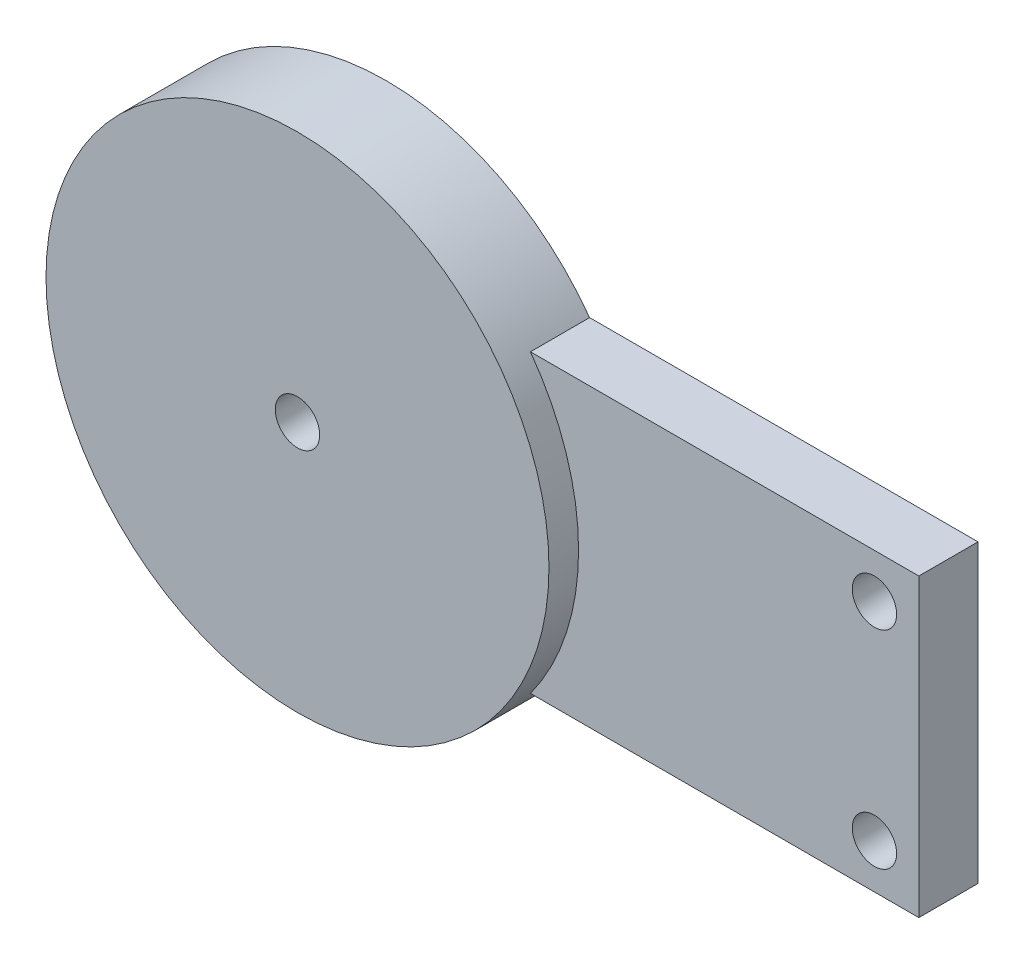
ISO-10303-21;
HEADER;
FILE_DESCRIPTION(('STEP AP214'),'2;1');
FILE_NAME('part.step','',(''),(''),'','','');
FILE_SCHEMA(('AUTOMOTIVE_DESIGN { 1 0 10303 214 1 1 1 1 }'));
ENDSEC;
DATA;
#1=APPLICATION_CONTEXT('core data for automotive mechanical design processes');
#2=APPLICATION_PROTOCOL_DEFINITION('international standard','automotive_design',2000,#1);
#3=PRODUCT_CONTEXT('',#1,'mechanical');
#4=PRODUCT('Part','Part','',(#3));
#5=PRODUCT_RELATED_PRODUCT_CATEGORY('part','',(#4));
#6=PRODUCT_DEFINITION_FORMATION('','',#4);
#7=PRODUCT_DEFINITION_CONTEXT('part definition',#1,'design');
#8=PRODUCT_DEFINITION('design','',#6,#7);
#9=PRODUCT_DEFINITION_SHAPE('','',#8);
#10=(LENGTH_UNIT() NAMED_UNIT(*) SI_UNIT(.MILLI.,.METRE.));
#11=(NAMED_UNIT(*) PLANE_ANGLE_UNIT() SI_UNIT($,.RADIAN.));
#12=(NAMED_UNIT(*) SI_UNIT($,.STERADIAN.) SOLID_ANGLE_UNIT());
#13=UNCERTAINTY_MEASURE_WITH_UNIT(LENGTH_MEASURE(1.E-05),#10,'distance_accuracy_value','');
#14=(GEOMETRIC_REPRESENTATION_CONTEXT(3) GLOBAL_UNCERTAINTY_ASSIGNED_CONTEXT((#13)) GLOBAL_UNIT_ASSIGNED_CONTEXT((#10,
#11,#12)) REPRESENTATION_CONTEXT('',''));
#15=CARTESIAN_POINT('',(0.,0.,0.));
#16=DIRECTION('',(0.,0.,1.));
#17=DIRECTION('',(1.,0.,0.));
#18=AXIS2_PLACEMENT_3D('',#15,#16,#17);
#19=CARTESIAN_POINT('',(-0.933123743386466,-6.90255919765331,1.));
#20=DIRECTION('',(-0.133966605224204,-0.990985846863971,0.));
#21=DIRECTION('',(0.990985846863971,-0.133966605224204,0.));
#22=AXIS2_PLACEMENT_3D('',#19,#20,#21);
#23=PLANE('',#22);
#24=DIRECTION('',(-0.990985846863971,0.133966605224204,0.));
#25=VECTOR('',#24,1.);
#26=CARTESIAN_POINT('',(-0.933123743386466,-6.90255919765331,1.));
#27=LINE('',#26,#25);
#28=CARTESIAN_POINT('',(-27.3521116164976,-3.33110342962163,1.));
#29=VERTEX_POINT('',#28);
#30=CARTESIAN_POINT('',(-33.5,-2.5,1.));
#31=VERTEX_POINT('',#30);
#32=EDGE_CURVE('E341',#29,#31,#27,.T.);
#33=ORIENTED_EDGE('',*,*,#32,.F.);
#34=DIRECTION('',(0.,0.,1.));
#35=VECTOR('',#34,1.);
#36=CARTESIAN_POINT('',(-27.3521116164976,-3.33110342962163,-2.));
#37=LINE('',#36,#35);
#38=CARTESIAN_POINT('',(-27.3521116164976,-3.33110342962163,-2.));
#39=VERTEX_POINT('',#38);
#40=EDGE_CURVE('E396',#29,#39,#37,.F.);
#41=ORIENTED_EDGE('',*,*,#40,.T.);
#42=DIRECTION('',(-0.990985846863971,0.133966605224204,0.));
#43=VECTOR('',#42,1.);
#44=CARTESIAN_POINT('',(-0.933123743386466,-6.90255919765331,-2.));
#45=LINE('',#44,#43);
#46=CARTESIAN_POINT('',(-33.5,-2.5,-2.));
#47=VERTEX_POINT('',#46);
#48=EDGE_CURVE('E349',#39,#47,#45,.T.);
#49=ORIENTED_EDGE('',*,*,#48,.T.);
#50=DIRECTION('',(0.,0.,-1.));
#51=VECTOR('',#50,1.);
#52=CARTESIAN_POINT('',(-33.5,-2.5,1.));
#53=LINE('',#52,#51);
#54=EDGE_CURVE('E347',#31,#47,#53,.T.);
#55=ORIENTED_EDGE('',*,*,#54,.F.);
#56=EDGE_LOOP('',(#33,#41,#49,#55));
#57=FACE_BOUND('',#56,.T.);
#58=ADVANCED_FACE('F41',(#57),#23,.F.);
#59=CARTESIAN_POINT('',(0.,0.,-2.));
#60=DIRECTION('',(0.,0.,-1.));
#61=DIRECTION('',(-1.,0.,0.));
#62=AXIS2_PLACEMENT_3D('',#59,#60,#61);
#63=PLANE('',#62);
#64=CARTESIAN_POINT('',(17.,7.,-2.));
#65=DIRECTION('',(0.,0.,-1.));
#66=DIRECTION('',(-1.,0.,0.));
#67=AXIS2_PLACEMENT_3D('',#64,#65,#66);
#68=CIRCLE('',#67,1.5);
#69=CARTESIAN_POINT('',(15.5,7.,-2.));
#70=VERTEX_POINT('',#69);
#71=EDGE_CURVE('E526',#70,#70,#68,.F.);
#72=ORIENTED_EDGE('',*,*,#71,.T.);
#73=EDGE_LOOP('',(#72));
#74=FACE_BOUND('',#73,.T.);
#75=CARTESIAN_POINT('',(17.,-7.,-2.));
#76=DIRECTION('',(0.,0.,-1.));
#77=DIRECTION('',(-1.,0.,0.));
#78=AXIS2_PLACEMENT_3D('',#75,#76,#77);
#79=CIRCLE('',#78,1.5);
#80=CARTESIAN_POINT('',(15.5,-7.,-2.));
#81=VERTEX_POINT('',#80);
#82=EDGE_CURVE('E523',#81,#81,#79,.F.);
#83=ORIENTED_EDGE('',*,*,#82,.T.);
#84=EDGE_LOOP('',(#83));
#85=FACE_BOUND('',#84,.T.);
#86=ORIENTED_EDGE('',*,*,#48,.F.);
#87=CARTESIAN_POINT('',(-27.4860782217218,-4.3220892764856,-2.));
#88=DIRECTION('',(0.,0.,-1.));
#89=DIRECTION('',(-1.,0.,0.));
#90=AXIS2_PLACEMENT_3D('',#87,#88,#89);
#91=CIRCLE('',#90,1.);
#92=CARTESIAN_POINT('',(-26.5608760009346,-4.70156371653467,-2.));
#93=VERTEX_POINT('',#92);
#94=EDGE_CURVE('E408',#39,#93,#91,.T.);
#95=ORIENTED_EDGE('',*,*,#94,.T.);
#96=DIRECTION('',(-0.379474440049075,-0.925202220787132,0.));
#97=VECTOR('',#96,1.);
#98=CARTESIAN_POINT('',(-16.4443534879867,19.9636788078683,-2.));
#99=LINE('',#98,#97);
#100=CARTESIAN_POINT('',(-28.9150635094612,-10.4413429510898,-2.));
#101=VERTEX_POINT('',#100);
#102=EDGE_CURVE('E251',#93,#101,#99,.T.);
#103=ORIENTED_EDGE('',*,*,#102,.T.);
#104=CARTESIAN_POINT('',(-26.7500000000001,-11.6913429510898,-2.));
#105=DIRECTION('',(0.,0.,-1.));
#106=DIRECTION('',(-0.50000000000001,-0.866025403784433,0.));
#107=AXIS2_PLACEMENT_3D('',#104,#105,#106);
#108=CIRCLE('',#107,2.5);
#109=CARTESIAN_POINT('',(-24.5849364905391,-12.9413429510899,-2.));
#110=VERTEX_POINT('',#109);
#111=EDGE_CURVE('E255',#110,#101,#108,.T.);
#112=ORIENTED_EDGE('',*,*,#111,.F.);
#113=DIRECTION('',(-0.611511406814916,-0.791235615562926,0.));
#114=VECTOR('',#113,1.);
#115=CARTESIAN_POINT('',(-4.48877025539938,13.0611196102148,-2.));
#116=LINE('',#115,#114);
#117=CARTESIAN_POINT('',(-20.791235615563,-8.03266714615627,-2.));
#118=VERTEX_POINT('',#117);
#119=EDGE_CURVE('E239',#118,#110,#116,.T.);
#120=ORIENTED_EDGE('',*,*,#119,.F.);
#121=CARTESIAN_POINT('',(-20.0000000000001,-8.64417855297119,-2.));
#122=DIRECTION('',(0.,0.,-1.));
#123=DIRECTION('',(-1.,0.,0.));
#124=AXIS2_PLACEMENT_3D('',#121,#122,#123);
#125=CIRCLE('',#124,1.);
#126=CARTESIAN_POINT('',(-19.2087643844372,-8.0326671461563,-2.));
#127=VERTEX_POINT('',#126);
#128=EDGE_CURVE('E398',#118,#127,#125,.T.);
#129=ORIENTED_EDGE('',*,*,#128,.T.);
#130=DIRECTION('',(0.6115114068149,-0.791235615562938,0.));
#131=VECTOR('',#130,1.);
#132=CARTESIAN_POINT('',(-35.5112297446003,13.0611196102152,-2.));
#133=LINE('',#132,#131);
#134=CARTESIAN_POINT('',(-15.4150635094612,-12.94134295109,-2.));
#135=VERTEX_POINT('',#134);
#136=EDGE_CURVE('E257',#127,#135,#133,.T.);
#137=ORIENTED_EDGE('',*,*,#136,.T.);
#138=CARTESIAN_POINT('',(-13.2500000000001,-11.69134295109,-2.));
#139=DIRECTION('',(0.,0.,-1.));
#140=DIRECTION('',(0.499999999999992,-0.866025403784443,0.));
#141=AXIS2_PLACEMENT_3D('',#138,#139,#140);
#142=CIRCLE('',#141,2.5);
#143=CARTESIAN_POINT('',(-11.084936490539,-10.44134295109,-2.));
#144=VERTEX_POINT('',#143);
#145=EDGE_CURVE('E262',#144,#135,#142,.T.);
#146=ORIENTED_EDGE('',*,*,#145,.F.);
#147=DIRECTION('',(0.379474440049056,-0.92520222078714,0.));
#148=VECTOR('',#147,1.);
#149=CARTESIAN_POINT('',(-23.5556465120129,19.9636788078684,-2.));
#150=LINE('',#149,#148);
#151=CARTESIAN_POINT('',(-13.4391239990655,-4.70156371653467,-2.));
#152=VERTEX_POINT('',#151);
#153=EDGE_CURVE('E269',#152,#144,#150,.T.);
#154=ORIENTED_EDGE('',*,*,#153,.F.);
#155=CARTESIAN_POINT('',(-12.5139217782784,-4.32208927648562,-2.));
#156=DIRECTION('',(0.,0.,-1.));
#157=DIRECTION('',(-1.,0.,0.));
#158=AXIS2_PLACEMENT_3D('',#155,#156,#157);
#159=CIRCLE('',#158,1.);
#160=CARTESIAN_POINT('',(-12.6478883835026,-3.33110342962165,-2.));
#161=VERTEX_POINT('',#160);
#162=EDGE_CURVE('E406',#152,#161,#159,.T.);
#163=ORIENTED_EDGE('',*,*,#162,.T.);
#164=DIRECTION('',(0.990985846863971,0.133966605224204,0.));
#165=VECTOR('',#164,1.);
#166=CARTESIAN_POINT('',(-39.0668762566135,-6.90255919765331,-2.));
#167=LINE('',#166,#165);
#168=CARTESIAN_POINT('',(-6.5,-2.5,-2.));
#169=VERTEX_POINT('',#168);
#170=EDGE_CURVE('E276',#161,#169,#167,.T.);
#171=ORIENTED_EDGE('',*,*,#170,.T.);
#172=CARTESIAN_POINT('',(-6.50000000000001,0.,-2.));
#173=DIRECTION('',(0.,0.,-1.));
#174=DIRECTION('',(1.,0.,0.));
#175=AXIS2_PLACEMENT_3D('',#172,#173,#174);
#176=CIRCLE('',#175,2.5);
#177=CARTESIAN_POINT('',(-6.5,2.5,-2.));
#178=VERTEX_POINT('',#177);
#179=EDGE_CURVE('E282',#178,#169,#176,.T.);
#180=ORIENTED_EDGE('',*,*,#179,.F.);
#181=DIRECTION('',(0.990985846863971,-0.133966605224204,0.));
#182=VECTOR('',#181,1.);
#183=CARTESIAN_POINT('',(-39.0668762566135,6.90255919765331,-2.));
#184=LINE('',#183,#182);
#185=CARTESIAN_POINT('',(-12.6478883835025,3.33110342962163,-2.));
#186=VERTEX_POINT('',#185);
#187=EDGE_CURVE('E289',#186,#178,#184,.T.);
#188=ORIENTED_EDGE('',*,*,#187,.F.);
#189=CARTESIAN_POINT('',(-12.5139217782783,4.3220892764856,-2.));
#190=DIRECTION('',(0.,0.,-1.));
#191=DIRECTION('',(-1.,0.,0.));
#192=AXIS2_PLACEMENT_3D('',#189,#190,#191);
#193=CIRCLE('',#192,1.);
#194=CARTESIAN_POINT('',(-13.4391239990654,4.70156371653467,-2.));
#195=VERTEX_POINT('',#194);
#196=EDGE_CURVE('E400',#186,#195,#193,.T.);
#197=ORIENTED_EDGE('',*,*,#196,.T.);
#198=DIRECTION('',(0.379474440049069,0.925202220787135,0.));
#199=VECTOR('',#198,1.);
#200=CARTESIAN_POINT('',(-23.5556465120132,-19.9636788078683,-2.));
#201=LINE('',#200,#199);
#202=CARTESIAN_POINT('',(-11.0849364905389,10.4413429510899,-2.));
#203=VERTEX_POINT('',#202);
#204=EDGE_CURVE('E296',#195,#203,#201,.T.);
#205=ORIENTED_EDGE('',*,*,#204,.T.);
#206=CARTESIAN_POINT('',(-13.2499999999999,11.6913429510899,-2.));
#207=DIRECTION('',(0.,0.,-1.));
#208=DIRECTION('',(0.500000000000004,0.866025403784436,0.));
#209=AXIS2_PLACEMENT_3D('',#206,#207,#208);
#210=CIRCLE('',#209,2.5);
#211=CARTESIAN_POINT('',(-15.415063509461,12.9413429510899,-2.));
#212=VERTEX_POINT('',#211);
#213=EDGE_CURVE('E302',#212,#203,#210,.T.);
#214=ORIENTED_EDGE('',*,*,#213,.F.);
#215=DIRECTION('',(0.611511406814911,0.79123561556293,0.));
#216=VECTOR('',#215,1.);
#217=CARTESIAN_POINT('',(-35.5112297446005,-13.0611196102149,-2.));
#218=LINE('',#217,#216);
#219=CARTESIAN_POINT('',(-19.208764384437,8.0326671461563,-2.));
#220=VERTEX_POINT('',#219);
#221=EDGE_CURVE('E309',#220,#212,#218,.T.);
#222=ORIENTED_EDGE('',*,*,#221,.F.);
#223=CARTESIAN_POINT('',(-20.,8.64417855297121,-2.));
#224=DIRECTION('',(0.,0.,-1.));
#225=DIRECTION('',(-1.,0.,0.));
#226=AXIS2_PLACEMENT_3D('',#223,#224,#225);
#227=CIRCLE('',#226,1.);
#228=CARTESIAN_POINT('',(-20.7912356155629,8.0326671461563,-2.));
#229=VERTEX_POINT('',#228);
#230=EDGE_CURVE('E402',#220,#229,#227,.T.);
#231=ORIENTED_EDGE('',*,*,#230,.T.);
#232=DIRECTION('',(-0.611511406814905,0.791235615562934,0.));
#233=VECTOR('',#232,1.);
#234=CARTESIAN_POINT('',(-4.48877025539957,-13.061119610215,-2.));
#235=LINE('',#234,#233);
#236=CARTESIAN_POINT('',(-24.5849364905389,12.9413429510899,-2.));
#237=VERTEX_POINT('',#236);
#238=EDGE_CURVE('E316',#229,#237,#235,.T.);
#239=ORIENTED_EDGE('',*,*,#238,.T.);
#240=CARTESIAN_POINT('',(-26.75,11.6913429510899,-2.));
#241=DIRECTION('',(0.,0.,-1.));
#242=DIRECTION('',(-0.499999999999998,0.86602540378444,0.));
#243=AXIS2_PLACEMENT_3D('',#240,#241,#242);
#244=CIRCLE('',#243,2.5);
#245=CARTESIAN_POINT('',(-28.9150635094611,10.4413429510899,-2.));
#246=VERTEX_POINT('',#245);
#247=EDGE_CURVE('E322',#246,#237,#244,.T.);
#248=ORIENTED_EDGE('',*,*,#247,.F.);
#249=DIRECTION('',(-0.379474440049062,0.925202220787137,0.));
#250=VECTOR('',#249,1.);
#251=CARTESIAN_POINT('',(-16.444353487987,-19.9636788078683,-2.));
#252=LINE('',#251,#250);
#253=CARTESIAN_POINT('',(-26.5608760009345,4.70156371653467,-2.));
#254=VERTEX_POINT('',#253);
#255=EDGE_CURVE('E329',#254,#246,#252,.T.);
#256=ORIENTED_EDGE('',*,*,#255,.F.);
#257=CARTESIAN_POINT('',(-27.4860782217217,4.3220892764856,-2.));
#258=DIRECTION('',(0.,0.,-1.));
#259=DIRECTION('',(-1.,0.,0.));
#260=AXIS2_PLACEMENT_3D('',#257,#258,#259);
#261=CIRCLE('',#260,1.);
#262=CARTESIAN_POINT('',(-27.3521116164975,3.33110342962164,-2.));
#263=VERTEX_POINT('',#262);
#264=EDGE_CURVE('E404',#254,#263,#261,.T.);
#265=ORIENTED_EDGE('',*,*,#264,.T.);
#266=DIRECTION('',(-0.990985846863971,-0.133966605224204,0.));
#267=VECTOR('',#266,1.);
#268=CARTESIAN_POINT('',(-0.933123743386466,6.90255919765331,-2.));
#269=LINE('',#268,#267);
#270=CARTESIAN_POINT('',(-33.5,2.5,-2.));
#271=VERTEX_POINT('',#270);
#272=EDGE_CURVE('E336',#263,#271,#269,.T.);
#273=ORIENTED_EDGE('',*,*,#272,.T.);
#274=CARTESIAN_POINT('',(-33.5,0.,-2.));
#275=DIRECTION('',(0.,0.,-1.));
#276=DIRECTION('',(-1.,0.,0.));
#277=AXIS2_PLACEMENT_3D('',#274,#275,#276);
#278=CIRCLE('',#277,2.5);
#279=EDGE_CURVE('E342',#47,#271,#278,.T.);
#280=ORIENTED_EDGE('',*,*,#279,.F.);
#281=EDGE_LOOP('',(#86,#95,#103,#112,#120,#129,#137,#146,#154,#163,#171,#180,#188,#197,#205,
#214,#222,#231,#239,#248,#256,#265,#273,#280));
#282=FACE_BOUND('',#281,.T.);
#283=DIRECTION('',(1.,0.,0.));
#284=VECTOR('',#283,1.);
#285=CARTESIAN_POINT('',(-20.,-10.,-2.));
#286=LINE('',#285,#284);
#287=CARTESIAN_POINT('',(-6.25227291513248,-10.,-2.));
#288=VERTEX_POINT('',#287);
#289=CARTESIAN_POINT('',(20.,-10.,-2.));
#290=VERTEX_POINT('',#289);
#291=EDGE_CURVE('E378',#288,#290,#286,.T.);
#292=ORIENTED_EDGE('',*,*,#291,.F.);
#293=CARTESIAN_POINT('',(-20.,0.,-2.));
#294=DIRECTION('',(0.,0.,-1.));
#295=DIRECTION('',(-1.,0.,0.));
#296=AXIS2_PLACEMENT_3D('',#293,#294,#295);
#297=CIRCLE('',#296,17.);
#298=CARTESIAN_POINT('',(-6.25227291513248,10.,-2.));
#299=VERTEX_POINT('',#298);
#300=EDGE_CURVE('E356',#299,#288,#297,.F.);
#301=ORIENTED_EDGE('',*,*,#300,.F.);
#302=DIRECTION('',(-1.,0.,0.));
#303=VECTOR('',#302,1.);
#304=CARTESIAN_POINT('',(-20.,10.,-2.));
#305=LINE('',#304,#303);
#306=CARTESIAN_POINT('',(20.,10.,-2.));
#307=VERTEX_POINT('',#306);
#308=EDGE_CURVE('E385',#307,#299,#305,.T.);
#309=ORIENTED_EDGE('',*,*,#308,.F.);
#310=DIRECTION('',(0.,1.,0.));
#311=VECTOR('',#310,1.);
#312=CARTESIAN_POINT('',(20.,-10.,-2.));
#313=LINE('',#312,#311);
#314=EDGE_CURVE('E373',#290,#307,#313,.T.);
#315=ORIENTED_EDGE('',*,*,#314,.F.);
#316=EDGE_LOOP('',(#292,#301,#309,#315));
#317=FACE_BOUND('',#316,.T.);
#318=ADVANCED_FACE('F455',(#74,#85,#282,#317),#63,.T.);
#319=CARTESIAN_POINT('',(-20.,10.,2.));
#320=DIRECTION('',(0.,-1.,0.));
#321=DIRECTION('',(0.,0.,-1.));
#322=AXIS2_PLACEMENT_3D('',#319,#320,#321);
#323=PLANE('',#322);
#324=DIRECTION('',(0.,0.,-1.));
#325=VECTOR('',#324,1.);
#326=CARTESIAN_POINT('',(-6.25227291513248,10.,4.));
#327=LINE('',#326,#325);
#328=CARTESIAN_POINT('',(-6.25227291513248,10.,2.));
#329=VERTEX_POINT('',#328);
#330=EDGE_CURVE('E370',#329,#299,#327,.T.);
#331=ORIENTED_EDGE('',*,*,#330,.F.);
#332=DIRECTION('',(-1.,0.,0.));
#333=VECTOR('',#332,1.);
#334=CARTESIAN_POINT('',(-20.,10.,2.));
#335=LINE('',#334,#333);
#336=CARTESIAN_POINT('',(20.,10.,2.));
#337=VERTEX_POINT('',#336);
#338=EDGE_CURVE('E377',#337,#329,#335,.T.);
#339=ORIENTED_EDGE('',*,*,#338,.F.);
#340=DIRECTION('',(0.,0.,-1.));
#341=VECTOR('',#340,1.);
#342=CARTESIAN_POINT('',(20.,10.,2.));
#343=LINE('',#342,#341);
#344=EDGE_CURVE('E390',#337,#307,#343,.T.);
#345=ORIENTED_EDGE('',*,*,#344,.T.);
#346=ORIENTED_EDGE('',*,*,#308,.T.);
#347=EDGE_LOOP('',(#331,#339,#345,#346));
#348=FACE_BOUND('',#347,.T.);
#349=ADVANCED_FACE('F555',(#348),#323,.F.);
#350=CARTESIAN_POINT('',(-20.,-10.,2.));
#351=DIRECTION('',(0.,1.,0.));
#352=DIRECTION('',(0.,0.,1.));
#353=AXIS2_PLACEMENT_3D('',#350,#351,#352);
#354=PLANE('',#353);
#355=DIRECTION('',(0.,0.,-1.));
#356=VECTOR('',#355,1.);
#357=CARTESIAN_POINT('',(-6.25227291513248,-10.,4.));
#358=LINE('',#357,#356);
#359=CARTESIAN_POINT('',(-6.25227291513248,-10.,2.));
#360=VERTEX_POINT('',#359);
#361=EDGE_CURVE('E367',#288,#360,#358,.F.);
#362=ORIENTED_EDGE('',*,*,#361,.F.);
#363=ORIENTED_EDGE('',*,*,#291,.T.);
#364=DIRECTION('',(0.,0.,-1.));
#365=VECTOR('',#364,1.);
#366=CARTESIAN_POINT('',(20.,-10.,2.));
#367=LINE('',#366,#365);
#368=CARTESIAN_POINT('',(20.,-10.,2.));
#369=VERTEX_POINT('',#368);
#370=EDGE_CURVE('E382',#369,#290,#367,.T.);
#371=ORIENTED_EDGE('',*,*,#370,.F.);
#372=DIRECTION('',(1.,0.,0.));
#373=VECTOR('',#372,1.);
#374=CARTESIAN_POINT('',(-20.,-10.,2.));
#375=LINE('',#374,#373);
#376=EDGE_CURVE('E380',#360,#369,#375,.T.);
#377=ORIENTED_EDGE('',*,*,#376,.F.);
#378=EDGE_LOOP('',(#362,#363,#371,#377));
#379=FACE_BOUND('',#378,.T.);
#380=ADVANCED_FACE('F547',(#379),#354,.F.);
#381=CARTESIAN_POINT('',(20.,-10.,2.));
#382=DIRECTION('',(-1.,0.,0.));
#383=DIRECTION('',(0.,0.,1.));
#384=AXIS2_PLACEMENT_3D('',#381,#382,#383);
#385=PLANE('',#384);
#386=ORIENTED_EDGE('',*,*,#314,.T.);
#387=ORIENTED_EDGE('',*,*,#344,.F.);
#388=DIRECTION('',(0.,1.,0.));
#389=VECTOR('',#388,1.);
#390=CARTESIAN_POINT('',(20.,-10.,2.));
#391=LINE('',#390,#389);
#392=EDGE_CURVE('E374',#369,#337,#391,.T.);
#393=ORIENTED_EDGE('',*,*,#392,.F.);
#394=ORIENTED_EDGE('',*,*,#370,.T.);
#395=EDGE_LOOP('',(#386,#387,#393,#394));
#396=FACE_BOUND('',#395,.T.);
#397=ADVANCED_FACE('F538',(#396),#385,.F.);
#398=CARTESIAN_POINT('',(0.,0.,2.));
#399=DIRECTION('',(0.,0.,-1.));
#400=DIRECTION('',(-1.,0.,0.));
#401=AXIS2_PLACEMENT_3D('',#398,#399,#400);
#402=PLANE('',#401);
#403=CARTESIAN_POINT('',(17.,7.,2.));
#404=DIRECTION('',(0.,0.,1.));
#405=DIRECTION('',(1.,0.,0.));
#406=AXIS2_PLACEMENT_3D('',#403,#404,#405);
#407=CIRCLE('',#406,1.5);
#408=CARTESIAN_POINT('',(18.5,7.,2.));
#409=VERTEX_POINT('',#408);
#410=EDGE_CURVE('E517',#409,#409,#407,.T.);
#411=ORIENTED_EDGE('',*,*,#410,.F.);
#412=EDGE_LOOP('',(#411));
#413=FACE_BOUND('',#412,.T.);
#414=CARTESIAN_POINT('',(17.,-7.,2.));
#415=DIRECTION('',(0.,0.,1.));
#416=DIRECTION('',(1.,0.,0.));
#417=AXIS2_PLACEMENT_3D('',#414,#415,#416);
#418=CIRCLE('',#417,1.5);
#419=CARTESIAN_POINT('',(18.5,-7.,2.));
#420=VERTEX_POINT('',#419);
#421=EDGE_CURVE('E520',#420,#420,#418,.T.);
#422=ORIENTED_EDGE('',*,*,#421,.F.);
#423=EDGE_LOOP('',(#422));
#424=FACE_BOUND('',#423,.T.);
#425=CARTESIAN_POINT('',(-20.,0.,2.));
#426=DIRECTION('',(0.,0.,-1.));
#427=DIRECTION('',(-1.,0.,0.));
#428=AXIS2_PLACEMENT_3D('',#425,#426,#427);
#429=CIRCLE('',#428,17.);
#430=EDGE_CURVE('E364',#360,#329,#429,.F.);
#431=ORIENTED_EDGE('',*,*,#430,.F.);
#432=ORIENTED_EDGE('',*,*,#376,.T.);
#433=ORIENTED_EDGE('',*,*,#392,.T.);
#434=ORIENTED_EDGE('',*,*,#338,.T.);
#435=EDGE_LOOP('',(#431,#432,#433,#434));
#436=FACE_BOUND('',#435,.T.);
#437=ADVANCED_FACE('F534',(#413,#424,#436),#402,.F.);
#438=CARTESIAN_POINT('',(-20.,0.,4.));
#439=DIRECTION('',(0.,0.,-1.));
#440=DIRECTION('',(-1.,0.,0.));
#441=AXIS2_PLACEMENT_3D('',#438,#439,#440);
#442=CYLINDRICAL_SURFACE('',#441,17.);
#443=CARTESIAN_POINT('',(-20.,0.,4.));
#444=DIRECTION('',(0.,0.,1.));
#445=DIRECTION('',(1.,0.,0.));
#446=AXIS2_PLACEMENT_3D('',#443,#444,#445);
#447=CIRCLE('',#446,17.);
#448=CARTESIAN_POINT('',(-3.,0.,4.));
#449=VERTEX_POINT('',#448);
#450=EDGE_CURVE('E361',#449,#449,#447,.T.);
#451=ORIENTED_EDGE('',*,*,#450,.F.);
#452=EDGE_LOOP('',(#451));
#453=FACE_BOUND('',#452,.T.);
#454=ORIENTED_EDGE('',*,*,#430,.T.);
#455=ORIENTED_EDGE('',*,*,#330,.T.);
#456=ORIENTED_EDGE('',*,*,#300,.T.);
#457=ORIENTED_EDGE('',*,*,#361,.T.);
#458=EDGE_LOOP('',(#454,#455,#456,#457));
#459=FACE_BOUND('',#458,.T.);
#460=ADVANCED_FACE('F537',(#453,#459),#442,.T.);
#461=CARTESIAN_POINT('',(-20.,0.,4.));
#462=DIRECTION('',(0.,0.,1.));
#463=DIRECTION('',(1.,0.,0.));
#464=AXIS2_PLACEMENT_3D('',#461,#462,#463);
#465=PLANE('',#464);
#466=CARTESIAN_POINT('',(-20.,0.,4.));
#467=DIRECTION('',(0.,0.,1.));
#468=DIRECTION('',(1.,0.,0.));
#469=AXIS2_PLACEMENT_3D('',#466,#467,#468);
#470=CIRCLE('',#469,1.5);
#471=CARTESIAN_POINT('',(-18.5,0.,4.));
#472=VERTEX_POINT('',#471);
#473=EDGE_CURVE('E253',#472,#472,#470,.T.);
#474=ORIENTED_EDGE('',*,*,#473,.F.);
#475=EDGE_LOOP('',(#474));
#476=FACE_BOUND('',#475,.T.);
#477=ORIENTED_EDGE('',*,*,#450,.T.);
#478=EDGE_LOOP('',(#477));
#479=FACE_BOUND('',#478,.T.);
#480=ADVANCED_FACE('F575',(#476,#479),#465,.T.);
#481=CARTESIAN_POINT('',(-0.933123743386466,6.90255919765331,1.));
#482=DIRECTION('',(0.133966605224204,-0.990985846863971,0.));
#483=DIRECTION('',(0.990985846863971,0.133966605224204,0.));
#484=AXIS2_PLACEMENT_3D('',#481,#482,#483);
#485=PLANE('',#484);
#486=ORIENTED_EDGE('',*,*,#272,.F.);
#487=DIRECTION('',(0.,0.,-1.));
#488=VECTOR('',#487,1.);
#489=CARTESIAN_POINT('',(-27.3521116164975,3.33110342962164,1.));
#490=LINE('',#489,#488);
#491=CARTESIAN_POINT('',(-27.3521116164975,3.33110342962164,1.));
#492=VERTEX_POINT('',#491);
#493=EDGE_CURVE('E418',#263,#492,#490,.F.);
#494=ORIENTED_EDGE('',*,*,#493,.T.);
#495=DIRECTION('',(-0.990985846863971,-0.133966605224204,0.));
#496=VECTOR('',#495,1.);
#497=CARTESIAN_POINT('',(-0.933123743386466,6.90255919765331,1.));
#498=LINE('',#497,#496);
#499=CARTESIAN_POINT('',(-33.5,2.5,1.));
#500=VERTEX_POINT('',#499);
#501=EDGE_CURVE('E339',#492,#500,#498,.T.);
#502=ORIENTED_EDGE('',*,*,#501,.T.);
#503=DIRECTION('',(0.,0.,-1.));
#504=VECTOR('',#503,1.);
#505=CARTESIAN_POINT('',(-33.5,2.5,1.));
#506=LINE('',#505,#504);
#507=EDGE_CURVE('E353',#500,#271,#506,.T.);
#508=ORIENTED_EDGE('',*,*,#507,.T.);
#509=EDGE_LOOP('',(#486,#494,#502,#508));
#510=FACE_BOUND('',#509,.T.);
#511=ADVANCED_FACE('F496',(#510),#485,.T.);
#512=CARTESIAN_POINT('',(-33.5,0.,1.));
#513=DIRECTION('',(0.,0.,-1.));
#514=DIRECTION('',(-1.,0.,0.));
#515=AXIS2_PLACEMENT_3D('',#512,#513,#514);
#516=CYLINDRICAL_SURFACE('',#515,2.5);
#517=ORIENTED_EDGE('',*,*,#279,.T.);
#518=ORIENTED_EDGE('',*,*,#507,.F.);
#519=CARTESIAN_POINT('',(-33.5,0.,1.));
#520=DIRECTION('',(0.,0.,-1.));
#521=DIRECTION('',(-1.,0.,0.));
#522=AXIS2_PLACEMENT_3D('',#519,#520,#521);
#523=CIRCLE('',#522,2.5);
#524=EDGE_CURVE('E344',#31,#500,#523,.T.);
#525=ORIENTED_EDGE('',*,*,#524,.F.);
#526=ORIENTED_EDGE('',*,*,#54,.T.);
#527=EDGE_LOOP('',(#517,#518,#525,#526));
#528=FACE_BOUND('',#527,.T.);
#529=ADVANCED_FACE('F502',(#528),#516,.F.);
#530=CARTESIAN_POINT('',(0.,0.,1.));
#531=DIRECTION('',(0.,0.,-1.));
#532=DIRECTION('',(-1.,0.,0.));
#533=AXIS2_PLACEMENT_3D('',#530,#531,#532);
#534=PLANE('',#533);
#535=CARTESIAN_POINT('',(-20.,0.,1.));
#536=DIRECTION('',(0.,0.,-1.));
#537=DIRECTION('',(-1.,0.,0.));
#538=AXIS2_PLACEMENT_3D('',#535,#536,#537);
#539=CIRCLE('',#538,1.5);
#540=CARTESIAN_POINT('',(-21.5,0.,1.));
#541=VERTEX_POINT('',#540);
#542=EDGE_CURVE('E514',#541,#541,#539,.F.);
#543=ORIENTED_EDGE('',*,*,#542,.T.);
#544=EDGE_LOOP('',(#543));
#545=FACE_BOUND('',#544,.T.);
#546=ORIENTED_EDGE('',*,*,#501,.F.);
#547=CARTESIAN_POINT('',(-27.4860782217217,4.3220892764856,1.));
#548=DIRECTION('',(0.,0.,-1.));
#549=DIRECTION('',(-1.,0.,0.));
#550=AXIS2_PLACEMENT_3D('',#547,#548,#549);
#551=CIRCLE('',#550,1.);
#552=CARTESIAN_POINT('',(-26.5608760009345,4.70156371653467,1.));
#553=VERTEX_POINT('',#552);
#554=EDGE_CURVE('E437',#492,#553,#551,.F.);
#555=ORIENTED_EDGE('',*,*,#554,.T.);
#556=DIRECTION('',(-0.379474440049062,0.925202220787137,0.));
#557=VECTOR('',#556,1.);
#558=CARTESIAN_POINT('',(-16.444353487987,-19.9636788078683,1.));
#559=LINE('',#558,#557);
#560=CARTESIAN_POINT('',(-28.9150635094611,10.4413429510899,1.));
#561=VERTEX_POINT('',#560);
#562=EDGE_CURVE('E321',#553,#561,#559,.T.);
#563=ORIENTED_EDGE('',*,*,#562,.T.);
#564=CARTESIAN_POINT('',(-26.75,11.6913429510899,1.));
#565=DIRECTION('',(0.,0.,-1.));
#566=DIRECTION('',(-0.499999999999998,0.86602540378444,0.));
#567=AXIS2_PLACEMENT_3D('',#564,#565,#566);
#568=CIRCLE('',#567,2.5);
#569=CARTESIAN_POINT('',(-24.5849364905389,12.9413429510899,1.));
#570=VERTEX_POINT('',#569);
#571=EDGE_CURVE('E324',#561,#570,#568,.T.);
#572=ORIENTED_EDGE('',*,*,#571,.T.);
#573=DIRECTION('',(-0.611511406814905,0.791235615562934,0.));
#574=VECTOR('',#573,1.);
#575=CARTESIAN_POINT('',(-4.48877025539957,-13.061119610215,1.));
#576=LINE('',#575,#574);
#577=CARTESIAN_POINT('',(-20.7912356155629,8.0326671461563,1.));
#578=VERTEX_POINT('',#577);
#579=EDGE_CURVE('E319',#578,#570,#576,.T.);
#580=ORIENTED_EDGE('',*,*,#579,.F.);
#581=CARTESIAN_POINT('',(-20.,8.64417855297121,1.));
#582=DIRECTION('',(0.,0.,-1.));
#583=DIRECTION('',(-1.,0.,0.));
#584=AXIS2_PLACEMENT_3D('',#581,#582,#583);
#585=CIRCLE('',#584,1.);
#586=CARTESIAN_POINT('',(-19.208764384437,8.0326671461563,1.));
#587=VERTEX_POINT('',#586);
#588=EDGE_CURVE('E439',#578,#587,#585,.F.);
#589=ORIENTED_EDGE('',*,*,#588,.T.);
#590=DIRECTION('',(0.611511406814911,0.79123561556293,0.));
#591=VECTOR('',#590,1.);
#592=CARTESIAN_POINT('',(-35.5112297446005,-13.0611196102149,1.));
#593=LINE('',#592,#591);
#594=CARTESIAN_POINT('',(-15.415063509461,12.9413429510899,1.));
#595=VERTEX_POINT('',#594);
#596=EDGE_CURVE('E301',#587,#595,#593,.T.);
#597=ORIENTED_EDGE('',*,*,#596,.T.);
#598=CARTESIAN_POINT('',(-13.2499999999999,11.6913429510899,1.));
#599=DIRECTION('',(0.,0.,-1.));
#600=DIRECTION('',(0.500000000000004,0.866025403784436,0.));
#601=AXIS2_PLACEMENT_3D('',#598,#599,#600);
#602=CIRCLE('',#601,2.5);
#603=CARTESIAN_POINT('',(-11.0849364905389,10.4413429510899,1.));
#604=VERTEX_POINT('',#603);
#605=EDGE_CURVE('E304',#595,#604,#602,.T.);
#606=ORIENTED_EDGE('',*,*,#605,.T.);
#607=DIRECTION('',(0.379474440049069,0.925202220787135,0.));
#608=VECTOR('',#607,1.);
#609=CARTESIAN_POINT('',(-23.5556465120132,-19.9636788078683,1.));
#610=LINE('',#609,#608);
#611=CARTESIAN_POINT('',(-13.4391239990654,4.70156371653467,1.));
#612=VERTEX_POINT('',#611);
#613=EDGE_CURVE('E299',#612,#604,#610,.T.);
#614=ORIENTED_EDGE('',*,*,#613,.F.);
#615=CARTESIAN_POINT('',(-12.5139217782783,4.3220892764856,1.));
#616=DIRECTION('',(0.,0.,-1.));
#617=DIRECTION('',(-1.,0.,0.));
#618=AXIS2_PLACEMENT_3D('',#615,#616,#617);
#619=CIRCLE('',#618,1.);
#620=CARTESIAN_POINT('',(-12.6478883835025,3.33110342962163,1.));
#621=VERTEX_POINT('',#620);
#622=EDGE_CURVE('E49',#612,#621,#619,.F.);
#623=ORIENTED_EDGE('',*,*,#622,.T.);
#624=DIRECTION('',(0.990985846863971,-0.133966605224204,0.));
#625=VECTOR('',#624,1.);
#626=CARTESIAN_POINT('',(-39.0668762566135,6.90255919765331,1.));
#627=LINE('',#626,#625);
#628=CARTESIAN_POINT('',(-6.5,2.5,1.));
#629=VERTEX_POINT('',#628);
#630=EDGE_CURVE('E281',#621,#629,#627,.T.);
#631=ORIENTED_EDGE('',*,*,#630,.T.);
#632=CARTESIAN_POINT('',(-6.50000000000001,0.,1.));
#633=DIRECTION('',(0.,0.,-1.));
#634=DIRECTION('',(1.,0.,0.));
#635=AXIS2_PLACEMENT_3D('',#632,#633,#634);
#636=CIRCLE('',#635,2.5);
#637=CARTESIAN_POINT('',(-6.5,-2.5,1.));
#638=VERTEX_POINT('',#637);
#639=EDGE_CURVE('E284',#629,#638,#636,.T.);
#640=ORIENTED_EDGE('',*,*,#639,.T.);
#641=DIRECTION('',(0.990985846863971,0.133966605224204,0.));
#642=VECTOR('',#641,1.);
#643=CARTESIAN_POINT('',(-39.0668762566135,-6.90255919765331,1.));
#644=LINE('',#643,#642);
#645=CARTESIAN_POINT('',(-12.6478883835026,-3.33110342962165,1.));
#646=VERTEX_POINT('',#645);
#647=EDGE_CURVE('E279',#646,#638,#644,.T.);
#648=ORIENTED_EDGE('',*,*,#647,.F.);
#649=CARTESIAN_POINT('',(-12.5139217782784,-4.32208927648562,1.));
#650=DIRECTION('',(0.,0.,-1.));
#651=DIRECTION('',(-1.,0.,0.));
#652=AXIS2_PLACEMENT_3D('',#649,#650,#651);
#653=CIRCLE('',#652,1.);
#654=CARTESIAN_POINT('',(-13.4391239990655,-4.70156371653467,1.));
#655=VERTEX_POINT('',#654);
#656=EDGE_CURVE('E435',#646,#655,#653,.F.);
#657=ORIENTED_EDGE('',*,*,#656,.T.);
#658=DIRECTION('',(0.379474440049056,-0.92520222078714,0.));
#659=VECTOR('',#658,1.);
#660=CARTESIAN_POINT('',(-23.5556465120129,19.9636788078684,1.));
#661=LINE('',#660,#659);
#662=CARTESIAN_POINT('',(-11.084936490539,-10.44134295109,1.));
#663=VERTEX_POINT('',#662);
#664=EDGE_CURVE('E261',#655,#663,#661,.T.);
#665=ORIENTED_EDGE('',*,*,#664,.T.);
#666=CARTESIAN_POINT('',(-13.2500000000001,-11.69134295109,1.));
#667=DIRECTION('',(0.,0.,-1.));
#668=DIRECTION('',(0.499999999999992,-0.866025403784443,0.));
#669=AXIS2_PLACEMENT_3D('',#666,#667,#668);
#670=CIRCLE('',#669,2.5);
#671=CARTESIAN_POINT('',(-15.4150635094612,-12.94134295109,1.));
#672=VERTEX_POINT('',#671);
#673=EDGE_CURVE('E264',#663,#672,#670,.T.);
#674=ORIENTED_EDGE('',*,*,#673,.T.);
#675=DIRECTION('',(0.6115114068149,-0.791235615562938,0.));
#676=VECTOR('',#675,1.);
#677=CARTESIAN_POINT('',(-35.5112297446003,13.0611196102152,1.));
#678=LINE('',#677,#676);
#679=CARTESIAN_POINT('',(-19.2087643844372,-8.0326671461563,1.));
#680=VERTEX_POINT('',#679);
#681=EDGE_CURVE('E259',#680,#672,#678,.T.);
#682=ORIENTED_EDGE('',*,*,#681,.F.);
#683=CARTESIAN_POINT('',(-20.0000000000001,-8.64417855297119,1.));
#684=DIRECTION('',(0.,0.,-1.));
#685=DIRECTION('',(-1.,0.,0.));
#686=AXIS2_PLACEMENT_3D('',#683,#684,#685);
#687=CIRCLE('',#686,1.);
#688=CARTESIAN_POINT('',(-20.791235615563,-8.03266714615627,1.));
#689=VERTEX_POINT('',#688);
#690=EDGE_CURVE('E11',#680,#689,#687,.F.);
#691=ORIENTED_EDGE('',*,*,#690,.T.);
#692=DIRECTION('',(-0.611511406814916,-0.791235615562926,0.));
#693=VECTOR('',#692,1.);
#694=CARTESIAN_POINT('',(-4.48877025539938,13.0611196102148,1.));
#695=LINE('',#694,#693);
#696=CARTESIAN_POINT('',(-24.5849364905391,-12.9413429510899,1.));
#697=VERTEX_POINT('',#696);
#698=EDGE_CURVE('E223',#689,#697,#695,.T.);
#699=ORIENTED_EDGE('',*,*,#698,.T.);
#700=CARTESIAN_POINT('',(-26.7500000000001,-11.6913429510898,1.));
#701=DIRECTION('',(0.,0.,-1.));
#702=DIRECTION('',(-0.50000000000001,-0.866025403784433,0.));
#703=AXIS2_PLACEMENT_3D('',#700,#701,#702);
#704=CIRCLE('',#703,2.5);
#705=CARTESIAN_POINT('',(-28.9150635094612,-10.4413429510898,1.));
#706=VERTEX_POINT('',#705);
#707=EDGE_CURVE('E229',#697,#706,#704,.T.);
#708=ORIENTED_EDGE('',*,*,#707,.T.);
#709=DIRECTION('',(-0.379474440049075,-0.925202220787132,0.));
#710=VECTOR('',#709,1.);
#711=CARTESIAN_POINT('',(-16.4443534879867,19.9636788078683,1.));
#712=LINE('',#711,#710);
#713=CARTESIAN_POINT('',(-26.5608760009346,-4.70156371653467,1.));
#714=VERTEX_POINT('',#713);
#715=EDGE_CURVE('E233',#714,#706,#712,.T.);
#716=ORIENTED_EDGE('',*,*,#715,.F.);
#717=CARTESIAN_POINT('',(-27.4860782217218,-4.3220892764856,1.));
#718=DIRECTION('',(0.,0.,-1.));
#719=DIRECTION('',(-1.,0.,0.));
#720=AXIS2_PLACEMENT_3D('',#717,#718,#719);
#721=CIRCLE('',#720,1.);
#722=EDGE_CURVE('E433',#714,#29,#721,.F.);
#723=ORIENTED_EDGE('',*,*,#722,.T.);
#724=ORIENTED_EDGE('',*,*,#32,.T.);
#725=ORIENTED_EDGE('',*,*,#524,.T.);
#726=EDGE_LOOP('',(#546,#555,#563,#572,#580,#589,#597,#606,#614,#623,#631,#640,#648,#657,#665,
#674,#682,#691,#699,#708,#716,#723,#724,#725));
#727=FACE_BOUND('',#726,.T.);
#728=ADVANCED_FACE('F226',(#545,#727),#534,.T.);
#729=CARTESIAN_POINT('',(-16.4443534879867,19.9636788078683,1.));
#730=DIRECTION('',(0.925202220787132,-0.379474440049075,0.));
#731=DIRECTION('',(0.379474440049075,0.925202220787132,0.));
#732=AXIS2_PLACEMENT_3D('',#729,#730,#731);
#733=PLANE('',#732);
#734=ORIENTED_EDGE('',*,*,#102,.F.);
#735=DIRECTION('',(0.,0.,1.));
#736=VECTOR('',#735,1.);
#737=CARTESIAN_POINT('',(-26.5608760009346,-4.70156371653467,1.));
#738=LINE('',#737,#736);
#739=EDGE_CURVE('E393',#93,#714,#738,.T.);
#740=ORIENTED_EDGE('',*,*,#739,.T.);
#741=ORIENTED_EDGE('',*,*,#715,.T.);
#742=DIRECTION('',(0.,0.,-1.));
#743=VECTOR('',#742,1.);
#744=CARTESIAN_POINT('',(-28.9150635094612,-10.4413429510898,1.));
#745=LINE('',#744,#743);
#746=EDGE_CURVE('E243',#706,#101,#745,.T.);
#747=ORIENTED_EDGE('',*,*,#746,.T.);
#748=EDGE_LOOP('',(#734,#740,#741,#747));
#749=FACE_BOUND('',#748,.T.);
#750=ADVANCED_FACE('F512',(#749),#733,.T.);
#751=CARTESIAN_POINT('',(-16.444353487987,-19.9636788078683,1.));
#752=DIRECTION('',(-0.925202220787137,-0.379474440049062,0.));
#753=DIRECTION('',(0.379474440049062,-0.925202220787137,0.));
#754=AXIS2_PLACEMENT_3D('',#751,#752,#753);
#755=PLANE('',#754);
#756=ORIENTED_EDGE('',*,*,#562,.F.);
#757=DIRECTION('',(0.,0.,-1.));
#758=VECTOR('',#757,1.);
#759=CARTESIAN_POINT('',(-26.5608760009345,4.70156371653466,-2.));
#760=LINE('',#759,#758);
#761=EDGE_CURVE('E415',#553,#254,#760,.T.);
#762=ORIENTED_EDGE('',*,*,#761,.T.);
#763=ORIENTED_EDGE('',*,*,#255,.T.);
#764=DIRECTION('',(0.,0.,-1.));
#765=VECTOR('',#764,1.);
#766=CARTESIAN_POINT('',(-28.9150635094611,10.4413429510899,1.));
#767=LINE('',#766,#765);
#768=EDGE_CURVE('E327',#561,#246,#767,.T.);
#769=ORIENTED_EDGE('',*,*,#768,.F.);
#770=EDGE_LOOP('',(#756,#762,#763,#769));
#771=FACE_BOUND('',#770,.T.);
#772=ADVANCED_FACE('F489',(#771),#755,.F.);
#773=CARTESIAN_POINT('',(-4.48877025539957,-13.061119610215,1.));
#774=DIRECTION('',(-0.791235615562934,-0.611511406814905,0.));
#775=DIRECTION('',(0.611511406814905,-0.791235615562934,0.));
#776=AXIS2_PLACEMENT_3D('',#773,#774,#775);
#777=PLANE('',#776);
#778=ORIENTED_EDGE('',*,*,#238,.F.);
#779=DIRECTION('',(0.,0.,-1.));
#780=VECTOR('',#779,1.);
#781=CARTESIAN_POINT('',(-20.7912356155629,8.0326671461563,1.));
#782=LINE('',#781,#780);
#783=EDGE_CURVE('E423',#229,#578,#782,.F.);
#784=ORIENTED_EDGE('',*,*,#783,.T.);
#785=ORIENTED_EDGE('',*,*,#579,.T.);
#786=DIRECTION('',(0.,0.,-1.));
#787=VECTOR('',#786,1.);
#788=CARTESIAN_POINT('',(-24.5849364905389,12.9413429510899,1.));
#789=LINE('',#788,#787);
#790=EDGE_CURVE('E333',#570,#237,#789,.T.);
#791=ORIENTED_EDGE('',*,*,#790,.T.);
#792=EDGE_LOOP('',(#778,#784,#785,#791));
#793=FACE_BOUND('',#792,.T.);
#794=ADVANCED_FACE('F478',(#793),#777,.T.);
#795=CARTESIAN_POINT('',(-26.75,11.6913429510899,1.));
#796=DIRECTION('',(0.,0.,-1.));
#797=DIRECTION('',(-1.,0.,0.));
#798=AXIS2_PLACEMENT_3D('',#795,#796,#797);
#799=CYLINDRICAL_SURFACE('',#798,2.5);
#800=ORIENTED_EDGE('',*,*,#247,.T.);
#801=ORIENTED_EDGE('',*,*,#790,.F.);
#802=ORIENTED_EDGE('',*,*,#571,.F.);
#803=ORIENTED_EDGE('',*,*,#768,.T.);
#804=EDGE_LOOP('',(#800,#801,#802,#803));
#805=FACE_BOUND('',#804,.T.);
#806=ADVANCED_FACE('F484',(#805),#799,.F.);
#807=CARTESIAN_POINT('',(-35.5112297446005,-13.0611196102149,1.));
#808=DIRECTION('',(-0.79123561556293,0.611511406814911,0.));
#809=DIRECTION('',(-0.611511406814911,-0.79123561556293,0.));
#810=AXIS2_PLACEMENT_3D('',#807,#808,#809);
#811=PLANE('',#810);
#812=ORIENTED_EDGE('',*,*,#596,.F.);
#813=DIRECTION('',(0.,0.,-1.));
#814=VECTOR('',#813,1.);
#815=CARTESIAN_POINT('',(-19.208764384437,8.0326671461563,-2.));
#816=LINE('',#815,#814);
#817=EDGE_CURVE('E420',#587,#220,#816,.T.);
#818=ORIENTED_EDGE('',*,*,#817,.T.);
#819=ORIENTED_EDGE('',*,*,#221,.T.);
#820=DIRECTION('',(0.,0.,-1.));
#821=VECTOR('',#820,1.);
#822=CARTESIAN_POINT('',(-15.415063509461,12.9413429510899,1.));
#823=LINE('',#822,#821);
#824=EDGE_CURVE('E307',#595,#212,#823,.T.);
#825=ORIENTED_EDGE('',*,*,#824,.F.);
#826=EDGE_LOOP('',(#812,#818,#819,#825));
#827=FACE_BOUND('',#826,.T.);
#828=ADVANCED_FACE('F470',(#827),#811,.F.);
#829=CARTESIAN_POINT('',(-23.5556465120132,-19.9636788078683,1.));
#830=DIRECTION('',(-0.925202220787135,0.379474440049068,0.));
#831=DIRECTION('',(-0.379474440049069,-0.925202220787135,0.));
#832=AXIS2_PLACEMENT_3D('',#829,#830,#831);
#833=PLANE('',#832);
#834=ORIENTED_EDGE('',*,*,#204,.F.);
#835=DIRECTION('',(0.,0.,-1.));
#836=VECTOR('',#835,1.);
#837=CARTESIAN_POINT('',(-13.4391239990654,4.70156371653467,1.));
#838=LINE('',#837,#836);
#839=EDGE_CURVE('E428',#195,#612,#838,.F.);
#840=ORIENTED_EDGE('',*,*,#839,.T.);
#841=ORIENTED_EDGE('',*,*,#613,.T.);
#842=DIRECTION('',(0.,0.,-1.));
#843=VECTOR('',#842,1.);
#844=CARTESIAN_POINT('',(-11.0849364905389,10.4413429510899,1.));
#845=LINE('',#844,#843);
#846=EDGE_CURVE('E313',#604,#203,#845,.T.);
#847=ORIENTED_EDGE('',*,*,#846,.T.);
#848=EDGE_LOOP('',(#834,#840,#841,#847));
#849=FACE_BOUND('',#848,.T.);
#850=ADVANCED_FACE('F460',(#849),#833,.T.);
#851=CARTESIAN_POINT('',(-13.2499999999999,11.6913429510899,1.));
#852=DIRECTION('',(0.,0.,-1.));
#853=DIRECTION('',(-1.,0.,0.));
#854=AXIS2_PLACEMENT_3D('',#851,#852,#853);
#855=CYLINDRICAL_SURFACE('',#854,2.5);
#856=ORIENTED_EDGE('',*,*,#213,.T.);
#857=ORIENTED_EDGE('',*,*,#846,.F.);
#858=ORIENTED_EDGE('',*,*,#605,.F.);
#859=ORIENTED_EDGE('',*,*,#824,.T.);
#860=EDGE_LOOP('',(#856,#857,#858,#859));
#861=FACE_BOUND('',#860,.T.);
#862=ADVANCED_FACE('F464',(#861),#855,.F.);
#863=CARTESIAN_POINT('',(-6.50000000000001,0.,1.));
#864=DIRECTION('',(0.,0.,-1.));
#865=DIRECTION('',(-1.,0.,0.));
#866=AXIS2_PLACEMENT_3D('',#863,#864,#865);
#867=CYLINDRICAL_SURFACE('',#866,2.5);
#868=ORIENTED_EDGE('',*,*,#179,.T.);
#869=DIRECTION('',(0.,0.,-1.));
#870=VECTOR('',#869,1.);
#871=CARTESIAN_POINT('',(-6.5,-2.5,1.));
#872=LINE('',#871,#870);
#873=EDGE_CURVE('E293',#638,#169,#872,.T.);
#874=ORIENTED_EDGE('',*,*,#873,.F.);
#875=ORIENTED_EDGE('',*,*,#639,.F.);
#876=DIRECTION('',(0.,0.,-1.));
#877=VECTOR('',#876,1.);
#878=CARTESIAN_POINT('',(-6.5,2.5,1.));
#879=LINE('',#878,#877);
#880=EDGE_CURVE('E287',#629,#178,#879,.T.);
#881=ORIENTED_EDGE('',*,*,#880,.T.);
#882=EDGE_LOOP('',(#868,#874,#875,#881));
#883=FACE_BOUND('',#882,.T.);
#884=ADVANCED_FACE('F653',(#883),#867,.F.);
#885=CARTESIAN_POINT('',(-39.0668762566135,-6.90255919765331,1.));
#886=DIRECTION('',(-0.133966605224204,0.990985846863971,0.));
#887=DIRECTION('',(-0.990985846863971,-0.133966605224204,0.));
#888=AXIS2_PLACEMENT_3D('',#885,#886,#887);
#889=PLANE('',#888);
#890=ORIENTED_EDGE('',*,*,#170,.F.);
#891=DIRECTION('',(0.,0.,-1.));
#892=VECTOR('',#891,1.);
#893=CARTESIAN_POINT('',(-12.6478883835026,-3.33110342962165,1.));
#894=LINE('',#893,#892);
#895=EDGE_CURVE('E413',#161,#646,#894,.F.);
#896=ORIENTED_EDGE('',*,*,#895,.T.);
#897=ORIENTED_EDGE('',*,*,#647,.T.);
#898=ORIENTED_EDGE('',*,*,#873,.T.);
#899=EDGE_LOOP('',(#890,#896,#897,#898));
#900=FACE_BOUND('',#899,.T.);
#901=ADVANCED_FACE('F660',(#900),#889,.T.);
#902=CARTESIAN_POINT('',(-39.0668762566135,6.90255919765331,1.));
#903=DIRECTION('',(0.133966605224204,0.990985846863971,0.));
#904=DIRECTION('',(-0.990985846863971,0.133966605224204,0.));
#905=AXIS2_PLACEMENT_3D('',#902,#903,#904);
#906=PLANE('',#905);
#907=ORIENTED_EDGE('',*,*,#630,.F.);
#908=DIRECTION('',(0.,0.,-1.));
#909=VECTOR('',#908,1.);
#910=CARTESIAN_POINT('',(-12.6478883835025,3.33110342962163,-2.));
#911=LINE('',#910,#909);
#912=EDGE_CURVE('E425',#621,#186,#911,.T.);
#913=ORIENTED_EDGE('',*,*,#912,.T.);
#914=ORIENTED_EDGE('',*,*,#187,.T.);
#915=ORIENTED_EDGE('',*,*,#880,.F.);
#916=EDGE_LOOP('',(#907,#913,#914,#915));
#917=FACE_BOUND('',#916,.T.);
#918=ADVANCED_FACE('F448',(#917),#906,.F.);
#919=CARTESIAN_POINT('',(-23.5556465120129,19.9636788078684,1.));
#920=DIRECTION('',(0.92520222078714,0.379474440049056,0.));
#921=DIRECTION('',(-0.379474440049056,0.92520222078714,0.));
#922=AXIS2_PLACEMENT_3D('',#919,#920,#921);
#923=PLANE('',#922);
#924=ORIENTED_EDGE('',*,*,#664,.F.);
#925=DIRECTION('',(0.,0.,-1.));
#926=VECTOR('',#925,1.);
#927=CARTESIAN_POINT('',(-13.4391239990655,-4.70156371653467,-2.));
#928=LINE('',#927,#926);
#929=EDGE_CURVE('E410',#655,#152,#928,.T.);
#930=ORIENTED_EDGE('',*,*,#929,.T.);
#931=ORIENTED_EDGE('',*,*,#153,.T.);
#932=DIRECTION('',(0.,0.,-1.));
#933=VECTOR('',#932,1.);
#934=CARTESIAN_POINT('',(-11.084936490539,-10.44134295109,1.));
#935=LINE('',#934,#933);
#936=EDGE_CURVE('E267',#663,#144,#935,.T.);
#937=ORIENTED_EDGE('',*,*,#936,.F.);
#938=EDGE_LOOP('',(#924,#930,#931,#937));
#939=FACE_BOUND('',#938,.T.);
#940=ADVANCED_FACE('F675',(#939),#923,.F.);
#941=CARTESIAN_POINT('',(-35.5112297446003,13.0611196102152,1.));
#942=DIRECTION('',(0.791235615562938,0.6115114068149,0.));
#943=DIRECTION('',(-0.6115114068149,0.791235615562938,0.));
#944=AXIS2_PLACEMENT_3D('',#941,#942,#943);
#945=PLANE('',#944);
#946=ORIENTED_EDGE('',*,*,#136,.F.);
#947=DIRECTION('',(0.,0.,-1.));
#948=VECTOR('',#947,1.);
#949=CARTESIAN_POINT('',(-19.2087643844372,-8.0326671461563,1.));
#950=LINE('',#949,#948);
#951=EDGE_CURVE('E56',#127,#680,#950,.F.);
#952=ORIENTED_EDGE('',*,*,#951,.T.);
#953=ORIENTED_EDGE('',*,*,#681,.T.);
#954=DIRECTION('',(0.,0.,-1.));
#955=VECTOR('',#954,1.);
#956=CARTESIAN_POINT('',(-15.4150635094612,-12.94134295109,1.));
#957=LINE('',#956,#955);
#958=EDGE_CURVE('E273',#672,#135,#957,.T.);
#959=ORIENTED_EDGE('',*,*,#958,.T.);
#960=EDGE_LOOP('',(#946,#952,#953,#959));
#961=FACE_BOUND('',#960,.T.);
#962=ADVANCED_FACE('F682',(#961),#945,.T.);
#963=CARTESIAN_POINT('',(-13.2500000000001,-11.69134295109,1.));
#964=DIRECTION('',(0.,0.,-1.));
#965=DIRECTION('',(-1.,0.,0.));
#966=AXIS2_PLACEMENT_3D('',#963,#964,#965);
#967=CYLINDRICAL_SURFACE('',#966,2.5);
#968=ORIENTED_EDGE('',*,*,#145,.T.);
#969=ORIENTED_EDGE('',*,*,#958,.F.);
#970=ORIENTED_EDGE('',*,*,#673,.F.);
#971=ORIENTED_EDGE('',*,*,#936,.T.);
#972=EDGE_LOOP('',(#968,#969,#970,#971));
#973=FACE_BOUND('',#972,.T.);
#974=ADVANCED_FACE('F690',(#973),#967,.F.);
#975=CARTESIAN_POINT('',(-26.7500000000001,-11.6913429510898,1.));
#976=DIRECTION('',(0.,0.,-1.));
#977=DIRECTION('',(-1.,0.,0.));
#978=AXIS2_PLACEMENT_3D('',#975,#976,#977);
#979=CYLINDRICAL_SURFACE('',#978,2.5);
#980=ORIENTED_EDGE('',*,*,#111,.T.);
#981=ORIENTED_EDGE('',*,*,#746,.F.);
#982=ORIENTED_EDGE('',*,*,#707,.F.);
#983=DIRECTION('',(0.,0.,-1.));
#984=VECTOR('',#983,1.);
#985=CARTESIAN_POINT('',(-24.5849364905391,-12.9413429510899,1.));
#986=LINE('',#985,#984);
#987=EDGE_CURVE('E236',#697,#110,#986,.T.);
#988=ORIENTED_EDGE('',*,*,#987,.T.);
#989=EDGE_LOOP('',(#980,#981,#982,#988));
#990=FACE_BOUND('',#989,.T.);
#991=ADVANCED_FACE('F246',(#990),#979,.F.);
#992=CARTESIAN_POINT('',(-4.48877025539938,13.0611196102148,1.));
#993=DIRECTION('',(0.791235615562926,-0.611511406814916,0.));
#994=DIRECTION('',(0.611511406814916,0.791235615562926,0.));
#995=AXIS2_PLACEMENT_3D('',#992,#993,#994);
#996=PLANE('',#995);
#997=ORIENTED_EDGE('',*,*,#698,.F.);
#998=DIRECTION('',(0.,0.,-1.));
#999=VECTOR('',#998,1.);
#1000=CARTESIAN_POINT('',(-20.791235615563,-8.03266714615627,-2.));
#1001=LINE('',#1000,#999);
#1002=EDGE_CURVE('E430',#689,#118,#1001,.T.);
#1003=ORIENTED_EDGE('',*,*,#1002,.T.);
#1004=ORIENTED_EDGE('',*,*,#119,.T.);
#1005=ORIENTED_EDGE('',*,*,#987,.F.);
#1006=EDGE_LOOP('',(#997,#1003,#1004,#1005));
#1007=FACE_BOUND('',#1006,.T.);
#1008=ADVANCED_FACE('F237',(#1007),#996,.F.);
#1009=CARTESIAN_POINT('',(-27.4860782217218,-4.3220892764856,1.));
#1010=DIRECTION('',(0.,0.,-1.));
#1011=DIRECTION('',(-1.,0.,0.));
#1012=AXIS2_PLACEMENT_3D('',#1009,#1010,#1011);
#1013=CYLINDRICAL_SURFACE('',#1012,1.);
#1014=ORIENTED_EDGE('',*,*,#94,.F.);
#1015=ORIENTED_EDGE('',*,*,#40,.F.);
#1016=ORIENTED_EDGE('',*,*,#722,.F.);
#1017=ORIENTED_EDGE('',*,*,#739,.F.);
#1018=EDGE_LOOP('',(#1014,#1015,#1016,#1017));
#1019=FACE_BOUND('',#1018,.T.);
#1020=ADVANCED_FACE('F510',(#1019),#1013,.T.);
#1021=CARTESIAN_POINT('',(-12.5139217782784,-4.32208927648562,1.));
#1022=DIRECTION('',(0.,0.,1.));
#1023=DIRECTION('',(1.,0.,0.));
#1024=AXIS2_PLACEMENT_3D('',#1021,#1022,#1023);
#1025=CYLINDRICAL_SURFACE('',#1024,1.);
#1026=ORIENTED_EDGE('',*,*,#656,.F.);
#1027=ORIENTED_EDGE('',*,*,#895,.F.);
#1028=ORIENTED_EDGE('',*,*,#162,.F.);
#1029=ORIENTED_EDGE('',*,*,#929,.F.);
#1030=EDGE_LOOP('',(#1026,#1027,#1028,#1029));
#1031=FACE_BOUND('',#1030,.T.);
#1032=ADVANCED_FACE('F715',(#1031),#1025,.T.);
#1033=CARTESIAN_POINT('',(-27.4860782217217,4.3220892764856,1.));
#1034=DIRECTION('',(0.,0.,1.));
#1035=DIRECTION('',(1.,0.,0.));
#1036=AXIS2_PLACEMENT_3D('',#1033,#1034,#1035);
#1037=CYLINDRICAL_SURFACE('',#1036,1.);
#1038=ORIENTED_EDGE('',*,*,#554,.F.);
#1039=ORIENTED_EDGE('',*,*,#493,.F.);
#1040=ORIENTED_EDGE('',*,*,#264,.F.);
#1041=ORIENTED_EDGE('',*,*,#761,.F.);
#1042=EDGE_LOOP('',(#1038,#1039,#1040,#1041));
#1043=FACE_BOUND('',#1042,.T.);
#1044=ADVANCED_FACE('F493',(#1043),#1037,.T.);
#1045=CARTESIAN_POINT('',(-20.,8.64417855297121,1.));
#1046=DIRECTION('',(0.,0.,1.));
#1047=DIRECTION('',(1.,0.,0.));
#1048=AXIS2_PLACEMENT_3D('',#1045,#1046,#1047);
#1049=CYLINDRICAL_SURFACE('',#1048,1.);
#1050=ORIENTED_EDGE('',*,*,#588,.F.);
#1051=ORIENTED_EDGE('',*,*,#783,.F.);
#1052=ORIENTED_EDGE('',*,*,#230,.F.);
#1053=ORIENTED_EDGE('',*,*,#817,.F.);
#1054=EDGE_LOOP('',(#1050,#1051,#1052,#1053));
#1055=FACE_BOUND('',#1054,.T.);
#1056=ADVANCED_FACE('F474',(#1055),#1049,.T.);
#1057=CARTESIAN_POINT('',(-12.5139217782783,4.3220892764856,1.));
#1058=DIRECTION('',(0.,0.,1.));
#1059=DIRECTION('',(1.,0.,0.));
#1060=AXIS2_PLACEMENT_3D('',#1057,#1058,#1059);
#1061=CYLINDRICAL_SURFACE('',#1060,1.);
#1062=ORIENTED_EDGE('',*,*,#622,.F.);
#1063=ORIENTED_EDGE('',*,*,#839,.F.);
#1064=ORIENTED_EDGE('',*,*,#196,.F.);
#1065=ORIENTED_EDGE('',*,*,#912,.F.);
#1066=EDGE_LOOP('',(#1062,#1063,#1064,#1065));
#1067=FACE_BOUND('',#1066,.T.);
#1068=ADVANCED_FACE('F451',(#1067),#1061,.T.);
#1069=CARTESIAN_POINT('',(-20.0000000000001,-8.64417855297119,1.));
#1070=DIRECTION('',(0.,0.,1.));
#1071=DIRECTION('',(1.,0.,0.));
#1072=AXIS2_PLACEMENT_3D('',#1069,#1070,#1071);
#1073=CYLINDRICAL_SURFACE('',#1072,1.);
#1074=ORIENTED_EDGE('',*,*,#690,.F.);
#1075=ORIENTED_EDGE('',*,*,#951,.F.);
#1076=ORIENTED_EDGE('',*,*,#128,.F.);
#1077=ORIENTED_EDGE('',*,*,#1002,.F.);
#1078=EDGE_LOOP('',(#1074,#1075,#1076,#1077));
#1079=FACE_BOUND('',#1078,.T.);
#1080=ADVANCED_FACE('F43',(#1079),#1073,.T.);
#1081=CARTESIAN_POINT('',(-20.,0.,-2.001));
#1082=DIRECTION('',(0.,0.,1.));
#1083=DIRECTION('',(1.,0.,0.));
#1084=AXIS2_PLACEMENT_3D('',#1081,#1082,#1083);
#1085=CYLINDRICAL_SURFACE('',#1084,1.5);
#1086=ORIENTED_EDGE('',*,*,#542,.F.);
#1087=EDGE_LOOP('',(#1086));
#1088=FACE_BOUND('',#1087,.T.);
#1089=ORIENTED_EDGE('',*,*,#473,.T.);
#1090=EDGE_LOOP('',(#1089));
#1091=FACE_BOUND('',#1090,.T.);
#1092=ADVANCED_FACE('F745',(#1088,#1091),#1085,.F.);
#1093=CARTESIAN_POINT('',(17.,-7.,-2.001));
#1094=DIRECTION('',(0.,0.,1.));
#1095=DIRECTION('',(1.,0.,0.));
#1096=AXIS2_PLACEMENT_3D('',#1093,#1094,#1095);
#1097=CYLINDRICAL_SURFACE('',#1096,1.5);
#1098=ORIENTED_EDGE('',*,*,#82,.F.);
#1099=EDGE_LOOP('',(#1098));
#1100=FACE_BOUND('',#1099,.T.);
#1101=ORIENTED_EDGE('',*,*,#421,.T.);
#1102=EDGE_LOOP('',(#1101));
#1103=FACE_BOUND('',#1102,.T.);
#1104=ADVANCED_FACE('F751',(#1100,#1103),#1097,.F.);
#1105=CARTESIAN_POINT('',(17.,7.,-2.001));
#1106=DIRECTION('',(0.,0.,1.));
#1107=DIRECTION('',(1.,0.,0.));
#1108=AXIS2_PLACEMENT_3D('',#1105,#1106,#1107);
#1109=CYLINDRICAL_SURFACE('',#1108,1.5);
#1110=ORIENTED_EDGE('',*,*,#71,.F.);
#1111=EDGE_LOOP('',(#1110));
#1112=FACE_BOUND('',#1111,.T.);
#1113=ORIENTED_EDGE('',*,*,#410,.T.);
#1114=EDGE_LOOP('',(#1113));
#1115=FACE_BOUND('',#1114,.T.);
#1116=ADVANCED_FACE('F532',(#1112,#1115),#1109,.F.);
#1117=CLOSED_SHELL('',(#58,#318,#349,#380,#397,#437,#460,#480,#511,#529,#728,#750,#772,#794,
#806,#828,#850,#862,#884,#901,#918,#940,#962,#974,#991,#1008,#1020,#1032,#1044,#1056,#1068,
#1080,#1092,#1104,#1116));
#1118=MANIFOLD_SOLID_BREP('B2',#1117);
#1119=ADVANCED_BREP_SHAPE_REPRESENTATION('',(#18,#1118),#14);
#1120=SHAPE_DEFINITION_REPRESENTATION(#9,#1119);
ENDSEC;
END-ISO-10303-21;
